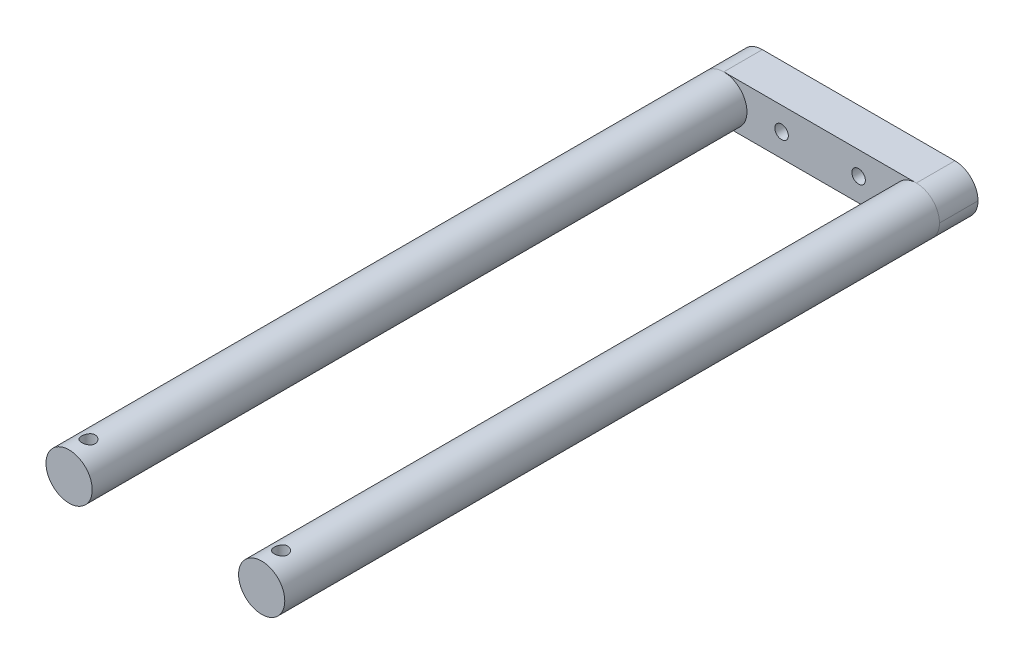
ISO-10303-21;
HEADER;
FILE_DESCRIPTION(('STEP AP214'),'2;1');
FILE_NAME('part.step','',(''),(''),'','','');
FILE_SCHEMA(('AUTOMOTIVE_DESIGN { 1 0 10303 214 1 1 1 1 }'));
ENDSEC;
DATA;
#1=APPLICATION_CONTEXT('core data for automotive mechanical design processes');
#2=APPLICATION_PROTOCOL_DEFINITION('international standard','automotive_design',2000,#1);
#3=PRODUCT_CONTEXT('',#1,'mechanical');
#4=PRODUCT('Part','Part','',(#3));
#5=PRODUCT_RELATED_PRODUCT_CATEGORY('part','',(#4));
#6=PRODUCT_DEFINITION_FORMATION('','',#4);
#7=PRODUCT_DEFINITION_CONTEXT('part definition',#1,'design');
#8=PRODUCT_DEFINITION('design','',#6,#7);
#9=PRODUCT_DEFINITION_SHAPE('','',#8);
#10=(LENGTH_UNIT() NAMED_UNIT(*) SI_UNIT(.MILLI.,.METRE.));
#11=(NAMED_UNIT(*) PLANE_ANGLE_UNIT() SI_UNIT($,.RADIAN.));
#12=(NAMED_UNIT(*) SI_UNIT($,.STERADIAN.) SOLID_ANGLE_UNIT());
#13=UNCERTAINTY_MEASURE_WITH_UNIT(LENGTH_MEASURE(1.E-05),#10,'distance_accuracy_value','');
#14=(GEOMETRIC_REPRESENTATION_CONTEXT(3) GLOBAL_UNCERTAINTY_ASSIGNED_CONTEXT((#13)) GLOBAL_UNIT_ASSIGNED_CONTEXT((#10,
#11,#12)) REPRESENTATION_CONTEXT('',''));
#15=CARTESIAN_POINT('',(0.,0.,0.));
#16=DIRECTION('',(0.,0.,1.));
#17=DIRECTION('',(1.,0.,0.));
#18=AXIS2_PLACEMENT_3D('',#15,#16,#17);
#19=CARTESIAN_POINT('',(0.,0.,10.));
#20=DIRECTION('',(0.,0.,1.));
#21=DIRECTION('',(1.,0.,0.));
#22=AXIS2_PLACEMENT_3D('',#19,#20,#21);
#23=PLANE('',#22);
#24=CARTESIAN_POINT('',(10.,0.,10.));
#25=DIRECTION('',(0.,0.,1.));
#26=DIRECTION('',(1.,0.,0.));
#27=AXIS2_PLACEMENT_3D('',#24,#25,#26);
#28=CIRCLE('',#27,1.75);
#29=CARTESIAN_POINT('',(11.75,0.,10.));
#30=VERTEX_POINT('',#29);
#31=EDGE_CURVE('E229',#30,#30,#28,.F.);
#32=ORIENTED_EDGE('',*,*,#31,.T.);
#33=EDGE_LOOP('',(#32));
#34=FACE_BOUND('',#33,.T.);
#35=CARTESIAN_POINT('',(-10.,0.,10.));
#36=DIRECTION('',(0.,0.,1.));
#37=DIRECTION('',(1.,0.,0.));
#38=AXIS2_PLACEMENT_3D('',#35,#36,#37);
#39=CIRCLE('',#38,1.75);
#40=CARTESIAN_POINT('',(-8.25,0.,10.));
#41=VERTEX_POINT('',#40);
#42=EDGE_CURVE('E223',#41,#41,#39,.F.);
#43=ORIENTED_EDGE('',*,*,#42,.T.);
#44=EDGE_LOOP('',(#43));
#45=FACE_BOUND('',#44,.T.);
#46=DIRECTION('',(1.,0.,0.));
#47=VECTOR('',#46,1.);
#48=CARTESIAN_POINT('',(-31.,-6.,10.));
#49=LINE('',#48,#47);
#50=CARTESIAN_POINT('',(-25.,-6.,10.));
#51=VERTEX_POINT('',#50);
#52=CARTESIAN_POINT('',(25.,-5.99999999999999,10.));
#53=VERTEX_POINT('',#52);
#54=EDGE_CURVE('E111',#51,#53,#49,.T.);
#55=ORIENTED_EDGE('',*,*,#54,.T.);
#56=CARTESIAN_POINT('',(25.,0.,10.));
#57=DIRECTION('',(0.,0.,1.));
#58=DIRECTION('',(1.,0.,0.));
#59=AXIS2_PLACEMENT_3D('',#56,#57,#58);
#60=CIRCLE('',#59,5.99999999999999);
#61=CARTESIAN_POINT('',(25.,5.99999999999999,10.));
#62=VERTEX_POINT('',#61);
#63=EDGE_CURVE('E97',#53,#62,#60,.F.);
#64=ORIENTED_EDGE('',*,*,#63,.T.);
#65=DIRECTION('',(-1.,0.,0.));
#66=VECTOR('',#65,1.);
#67=CARTESIAN_POINT('',(-31.,6.,10.));
#68=LINE('',#67,#66);
#69=CARTESIAN_POINT('',(-25.,5.99999999999999,10.));
#70=VERTEX_POINT('',#69);
#71=EDGE_CURVE('E108',#62,#70,#68,.T.);
#72=ORIENTED_EDGE('',*,*,#71,.T.);
#73=CARTESIAN_POINT('',(-25.,0.,10.));
#74=DIRECTION('',(0.,0.,1.));
#75=DIRECTION('',(1.,0.,0.));
#76=AXIS2_PLACEMENT_3D('',#73,#74,#75);
#77=CIRCLE('',#76,5.99999999999999);
#78=EDGE_CURVE('E216',#51,#70,#77,.T.);
#79=ORIENTED_EDGE('',*,*,#78,.F.);
#80=EDGE_LOOP('',(#55,#64,#72,#79));
#81=FACE_BOUND('',#80,.T.);
#82=ADVANCED_FACE('F34',(#34,#45,#81),#23,.T.);
#83=CARTESIAN_POINT('',(-31.,6.,10.));
#84=DIRECTION('',(0.,-1.,0.));
#85=DIRECTION('',(0.,0.,-1.));
#86=AXIS2_PLACEMENT_3D('',#83,#84,#85);
#87=PLANE('',#86);
#88=DIRECTION('',(-1.,0.,0.));
#89=VECTOR('',#88,1.);
#90=CARTESIAN_POINT('',(-31.,6.,0.));
#91=LINE('',#90,#89);
#92=CARTESIAN_POINT('',(25.,6.,0.));
#93=VERTEX_POINT('',#92);
#94=CARTESIAN_POINT('',(-25.,6.,0.));
#95=VERTEX_POINT('',#94);
#96=EDGE_CURVE('E213',#93,#95,#91,.T.);
#97=ORIENTED_EDGE('',*,*,#96,.T.);
#98=DIRECTION('',(0.,0.,-1.));
#99=VECTOR('',#98,1.);
#100=CARTESIAN_POINT('',(-25.,6.,10.));
#101=LINE('',#100,#99);
#102=EDGE_CURVE('E118',#95,#70,#101,.F.);
#103=ORIENTED_EDGE('',*,*,#102,.T.);
#104=ORIENTED_EDGE('',*,*,#71,.F.);
#105=DIRECTION('',(0.,0.,-1.));
#106=VECTOR('',#105,1.);
#107=CARTESIAN_POINT('',(25.,6.,10.));
#108=LINE('',#107,#106);
#109=EDGE_CURVE('E116',#62,#93,#108,.T.);
#110=ORIENTED_EDGE('',*,*,#109,.T.);
#111=EDGE_LOOP('',(#97,#103,#104,#110));
#112=FACE_BOUND('',#111,.T.);
#113=ADVANCED_FACE('F115',(#112),#87,.F.);
#114=CARTESIAN_POINT('',(-31.,-6.,10.));
#115=DIRECTION('',(0.,1.,0.));
#116=DIRECTION('',(0.,0.,1.));
#117=AXIS2_PLACEMENT_3D('',#114,#115,#116);
#118=PLANE('',#117);
#119=ORIENTED_EDGE('',*,*,#54,.F.);
#120=DIRECTION('',(0.,0.,-1.));
#121=VECTOR('',#120,1.);
#122=CARTESIAN_POINT('',(-25.,-6.,10.));
#123=LINE('',#122,#121);
#124=CARTESIAN_POINT('',(-25.,-6.,0.));
#125=VERTEX_POINT('',#124);
#126=EDGE_CURVE('E205',#51,#125,#123,.T.);
#127=ORIENTED_EDGE('',*,*,#126,.T.);
#128=DIRECTION('',(1.,0.,0.));
#129=VECTOR('',#128,1.);
#130=CARTESIAN_POINT('',(-31.,-6.,0.));
#131=LINE('',#130,#129);
#132=CARTESIAN_POINT('',(25.,-6.,0.));
#133=VERTEX_POINT('',#132);
#134=EDGE_CURVE('E119',#125,#133,#131,.T.);
#135=ORIENTED_EDGE('',*,*,#134,.T.);
#136=DIRECTION('',(0.,0.,-1.));
#137=VECTOR('',#136,1.);
#138=CARTESIAN_POINT('',(25.,-6.,10.));
#139=LINE('',#138,#137);
#140=EDGE_CURVE('E202',#133,#53,#139,.F.);
#141=ORIENTED_EDGE('',*,*,#140,.T.);
#142=EDGE_LOOP('',(#119,#127,#135,#141));
#143=FACE_BOUND('',#142,.T.);
#144=ADVANCED_FACE('F176',(#143),#118,.F.);
#145=CARTESIAN_POINT('',(0.,0.,0.));
#146=DIRECTION('',(0.,0.,1.));
#147=DIRECTION('',(1.,0.,0.));
#148=AXIS2_PLACEMENT_3D('',#145,#146,#147);
#149=PLANE('',#148);
#150=CARTESIAN_POINT('',(10.,0.,0.));
#151=DIRECTION('',(0.,0.,-1.));
#152=DIRECTION('',(-1.,0.,0.));
#153=AXIS2_PLACEMENT_3D('',#150,#151,#152);
#154=CIRCLE('',#153,1.75);
#155=CARTESIAN_POINT('',(8.25,0.,0.));
#156=VERTEX_POINT('',#155);
#157=EDGE_CURVE('E133',#156,#156,#154,.T.);
#158=ORIENTED_EDGE('',*,*,#157,.F.);
#159=EDGE_LOOP('',(#158));
#160=FACE_BOUND('',#159,.T.);
#161=CARTESIAN_POINT('',(-10.,0.,0.));
#162=DIRECTION('',(0.,0.,-1.));
#163=DIRECTION('',(-1.,0.,0.));
#164=AXIS2_PLACEMENT_3D('',#161,#162,#163);
#165=CIRCLE('',#164,1.75);
#166=CARTESIAN_POINT('',(-11.75,0.,0.));
#167=VERTEX_POINT('',#166);
#168=EDGE_CURVE('E226',#167,#167,#165,.T.);
#169=ORIENTED_EDGE('',*,*,#168,.F.);
#170=EDGE_LOOP('',(#169));
#171=FACE_BOUND('',#170,.T.);
#172=ORIENTED_EDGE('',*,*,#134,.F.);
#173=CARTESIAN_POINT('',(-25.,0.,0.));
#174=DIRECTION('',(0.,0.,1.));
#175=DIRECTION('',(1.,0.,0.));
#176=AXIS2_PLACEMENT_3D('',#173,#174,#175);
#177=CIRCLE('',#176,6.);
#178=CARTESIAN_POINT('',(-31.,0.,0.));
#179=VERTEX_POINT('',#178);
#180=EDGE_CURVE('E122',#125,#179,#177,.F.);
#181=ORIENTED_EDGE('',*,*,#180,.T.);
#182=CARTESIAN_POINT('',(-25.,0.,0.));
#183=DIRECTION('',(0.,0.,1.));
#184=DIRECTION('',(1.,0.,0.));
#185=AXIS2_PLACEMENT_3D('',#182,#183,#184);
#186=CIRCLE('',#185,6.);
#187=EDGE_CURVE('E54',#179,#95,#186,.F.);
#188=ORIENTED_EDGE('',*,*,#187,.T.);
#189=ORIENTED_EDGE('',*,*,#96,.F.);
#190=CARTESIAN_POINT('',(25.,0.,0.));
#191=DIRECTION('',(0.,0.,1.));
#192=DIRECTION('',(1.,0.,0.));
#193=AXIS2_PLACEMENT_3D('',#190,#191,#192);
#194=CIRCLE('',#193,6.);
#195=CARTESIAN_POINT('',(31.,0.,0.));
#196=VERTEX_POINT('',#195);
#197=EDGE_CURVE('E62',#93,#196,#194,.F.);
#198=ORIENTED_EDGE('',*,*,#197,.T.);
#199=CARTESIAN_POINT('',(25.,0.,0.));
#200=DIRECTION('',(0.,0.,1.));
#201=DIRECTION('',(1.,0.,0.));
#202=AXIS2_PLACEMENT_3D('',#199,#200,#201);
#203=CIRCLE('',#202,6.);
#204=EDGE_CURVE('E201',#196,#133,#203,.F.);
#205=ORIENTED_EDGE('',*,*,#204,.T.);
#206=EDGE_LOOP('',(#172,#181,#188,#189,#198,#205));
#207=FACE_BOUND('',#206,.T.);
#208=ADVANCED_FACE('F183',(#160,#171,#207),#149,.F.);
#209=CARTESIAN_POINT('',(-25.,0.,180.));
#210=DIRECTION('',(0.,0.,-1.));
#211=DIRECTION('',(-1.,0.,0.));
#212=AXIS2_PLACEMENT_3D('',#209,#210,#211);
#213=CYLINDRICAL_SURFACE('',#212,5.99999999999999);
#214=CARTESIAN_POINT('',(-25.,-5.99999999999999,176.75));
#215=CARTESIAN_POINT('',(-24.9038746919819,-5.99999897932777,176.749998515148));
#216=CARTESIAN_POINT('',(-24.8077342610221,-5.99766772555915,176.742053590018));
#217=CARTESIAN_POINT('',(-24.6182453338816,-5.98859526937578,176.710554203932));
#218=CARTESIAN_POINT('',(-24.5248978134295,-5.98185254415877,176.686994352799));
#219=CARTESIAN_POINT('',(-24.3437556707296,-5.96469737869573,176.625112993817));
#220=CARTESIAN_POINT('',(-24.2559533275376,-5.95429017982354,176.586812562489));
#221=CARTESIAN_POINT('',(-24.0880170763676,-5.93089244308037,176.4966215584));
#222=CARTESIAN_POINT('',(-24.0078840631656,-5.91790160432061,176.444729402533));
#223=CARTESIAN_POINT('',(-23.8553743811309,-5.89033024399656,176.327334984187));
#224=CARTESIAN_POINT('',(-23.7832366435688,-5.87571850769826,176.261529664167));
#225=CARTESIAN_POINT('',(-23.6508483335476,-5.8467419891084,176.118823271007));
#226=CARTESIAN_POINT('',(-23.5905996311233,-5.83237724599042,176.041920455622));
#227=CARTESIAN_POINT('',(-23.4824666332596,-5.8051938351212,175.877210332861));
#228=CARTESIAN_POINT('',(-23.4348695839556,-5.79241411758614,175.789207418234));
#229=CARTESIAN_POINT('',(-23.3552460863704,-5.77031231698369,175.606013923598));
#230=CARTESIAN_POINT('',(-23.3232161293996,-5.76098945488302,175.510824968855));
#231=CARTESIAN_POINT('',(-23.2764893691659,-5.74718144308773,175.318635370298));
#232=CARTESIAN_POINT('',(-23.2613539098261,-5.74257413524903,175.221750382535));
#233=CARTESIAN_POINT('',(-23.2474765365576,-5.73835505823414,175.026715208586));
#234=CARTESIAN_POINT('',(-23.2487308936446,-5.73874215273941,174.928565315265));
#235=CARTESIAN_POINT('',(-23.2672520472347,-5.74435959682318,174.737315245408));
#236=CARTESIAN_POINT('',(-23.2839743160693,-5.74942523520473,174.644156704703));
#237=CARTESIAN_POINT('',(-23.3320788250214,-5.76356324195847,174.462029189039));
#238=CARTESIAN_POINT('',(-23.3634624403772,-5.77263598619393,174.373060607962));
#239=CARTESIAN_POINT('',(-23.440410747292,-5.79390080921966,174.200484008019));
#240=CARTESIAN_POINT('',(-23.4861557160676,-5.80613217077635,174.116961417586));
#241=CARTESIAN_POINT('',(-23.5904028022505,-5.83231660479804,173.958593232403));
#242=CARTESIAN_POINT('',(-23.6489078641296,-5.84627007432714,173.883749646505));
#243=CARTESIAN_POINT('',(-23.779739593428,-5.87499914138166,173.74176939697));
#244=CARTESIAN_POINT('',(-23.8525196016261,-5.88978548224526,173.675051965685));
#245=CARTESIAN_POINT('',(-24.0084186911144,-5.91802612754817,173.554674579843));
#246=CARTESIAN_POINT('',(-24.0915383536547,-5.9314803570256,173.501015359863));
#247=CARTESIAN_POINT('',(-24.2664897280912,-5.95565253423198,173.408041655653));
#248=CARTESIAN_POINT('',(-24.3583709878036,-5.96635347926387,173.368815692189));
#249=CARTESIAN_POINT('',(-24.5478100720864,-5.98369087780732,173.306494829149));
#250=CARTESIAN_POINT('',(-24.645366395997,-5.99032840050987,173.283395685967));
#251=CARTESIAN_POINT('',(-24.8398188019716,-5.99862388766846,173.254671729569));
#252=CARTESIAN_POINT('',(-24.9366241055354,-6.00044382600872,173.24847829102));
#253=CARTESIAN_POINT('',(-25.1298949552109,-5.99937180655024,173.25215387819));
#254=CARTESIAN_POINT('',(-25.2263605424411,-5.9964804401206,173.26202088798));
#255=CARTESIAN_POINT('',(-25.4140978306641,-5.98641640064661,173.297075586824));
#256=CARTESIAN_POINT('',(-25.505436223328,-5.979335539798,173.321934939898));
#257=CARTESIAN_POINT('',(-25.6826291039212,-5.96170716095041,173.385877219331));
#258=CARTESIAN_POINT('',(-25.7684829453071,-5.95115923513567,173.424961819003));
#259=CARTESIAN_POINT('',(-25.9343925731249,-5.92740206937565,173.517225337923));
#260=CARTESIAN_POINT('',(-26.0142766127,-5.91413878305623,173.570698810949));
#261=CARTESIAN_POINT('',(-26.1641329608488,-5.88647695237989,173.689861149215));
#262=CARTESIAN_POINT('',(-26.2341029125755,-5.87207813933965,173.755552910517));
#263=CARTESIAN_POINT('',(-26.3646215858374,-5.84315282434341,173.89995535039));
#264=CARTESIAN_POINT('',(-26.424766422283,-5.82863878716342,173.979034343808));
#265=CARTESIAN_POINT('',(-26.5309555158763,-5.80165389300295,174.146476972735));
#266=CARTESIAN_POINT('',(-26.5770002187398,-5.78918297144385,174.234840314639));
#267=CARTESIAN_POINT('',(-26.6533535557184,-5.76784149110913,174.418009068341));
#268=CARTESIAN_POINT('',(-26.6837418654971,-5.75895275395433,174.51277902916));
#269=CARTESIAN_POINT('',(-26.7280482208509,-5.7458153184576,174.706395503132));
#270=CARTESIAN_POINT('',(-26.741971522099,-5.74156513950939,174.805240705027));
#271=CARTESIAN_POINT('',(-26.7526089517066,-5.73832630544295,175.000022541182));
#272=CARTESIAN_POINT('',(-26.7499789121505,-5.73913712613565,175.095920509864));
#273=CARTESIAN_POINT('',(-26.7291383184724,-5.74545008197208,175.285842892854));
#274=CARTESIAN_POINT('',(-26.7109283259395,-5.75095204802056,175.379867374567));
#275=CARTESIAN_POINT('',(-26.6598574803392,-5.76589662443702,175.562366183013));
#276=CARTESIAN_POINT('',(-26.6271612507962,-5.77529488178539,175.650890475405));
#277=CARTESIAN_POINT('',(-26.5481736361734,-5.79696714255005,175.821267246122));
#278=CARTESIAN_POINT('',(-26.5018797622437,-5.80924167234267,175.903118499537));
#279=CARTESIAN_POINT('',(-26.3951312814653,-5.83581435741764,176.060892070238));
#280=CARTESIAN_POINT('',(-26.3342416245588,-5.85016789019054,176.136510717542));
#281=CARTESIAN_POINT('',(-26.2008245265538,-5.87900256664697,176.276669675805));
#282=CARTESIAN_POINT('',(-26.1282941220337,-5.8934837419353,176.341207157114));
#283=CARTESIAN_POINT('',(-25.9712851746028,-5.92141239923085,176.459109531477));
#284=CARTESIAN_POINT('',(-25.8865360636143,-5.93482122382385,176.51212417615));
#285=CARTESIAN_POINT('',(-25.7089364520742,-5.95864200095581,176.603075249555));
#286=CARTESIAN_POINT('',(-25.6160901493361,-5.96905549446414,176.641019435231));
#287=CARTESIAN_POINT('',(-25.4366051778704,-5.98468728404805,176.696940949308));
#288=CARTESIAN_POINT('',(-25.3505861970507,-5.99038360588641,176.716786270558));
#289=CARTESIAN_POINT('',(-25.1763821745559,-5.99804015775583,176.743315510613));
#290=CARTESIAN_POINT('',(-25.0881974529297,-6.00000093649311,176.75000136239));
#291=CARTESIAN_POINT('',(-25.,-5.99999999999999,176.75));
#292=B_SPLINE_CURVE_WITH_KNOTS('',3,(#214,#215,#216,#217,#218,#219,#220,#221,#222,#223,#224,
#225,#226,#227,#228,#229,#230,#231,#232,#233,#234,#235,#236,#237,#238,#239,#240,#241,#242,#243,
#244,#245,#246,#247,#248,#249,#250,#251,#252,#253,#254,#255,#256,#257,#258,#259,#260,#261,#262,
#263,#264,#265,#266,#267,#268,#269,#270,#271,#272,#273,#274,#275,#276,#277,#278,#279,#280,#281,
#282,#283,#284,#285,#286,#287,#288,#289,#290,#291),.UNSPECIFIED.,.T.,.F.,(4,2,2,2,2,2,2,2,2,2,2,
2,2,2,2,2,2,2,2,2,2,2,2,2,2,2,2,2,2,2,2,2,2,2,2,2,2,2,4),(0.,0.288052093618853,
0.576203672859806,0.863944765925743,1.15171938874705,1.44656421076711,1.74145537223884,
2.0425595140536,2.34359575805744,2.63661948180929,2.92957653844229,3.21259753810653,
3.49564509054991,3.78239825352139,4.06921765673402,4.36732499534254,4.6654490998204,
4.96537230276013,5.26521655422947,5.55484346037067,5.84443401496554,6.12790175562712,
6.41140285130437,6.70121883369903,6.99110359801336,7.29089914342067,7.59068521108751,
7.88893020644376,8.18707997551209,8.47349366019237,8.7598970213495,9.04312596000905,
9.32640677192027,9.61950228446211,9.91267252994442,10.2137891731666,10.5147506265853,
10.779084693066,11.0433799290662),.UNSPECIFIED.);
#293=CARTESIAN_POINT('',(-25.,-5.99999999999999,176.75));
#294=VERTEX_POINT('',#293);
#295=EDGE_CURVE('E11',#294,#294,#292,.T.);
#296=ORIENTED_EDGE('',*,*,#295,.T.);
#297=EDGE_LOOP('',(#296));
#298=FACE_BOUND('',#297,.T.);
#299=CARTESIAN_POINT('',(-25.,5.99999999999999,176.75));
#300=CARTESIAN_POINT('',(-25.0961253080181,5.99999897932777,176.749998515148));
#301=CARTESIAN_POINT('',(-25.1922657389779,5.99766772555915,176.742053590018));
#302=CARTESIAN_POINT('',(-25.3817546661184,5.98859526937578,176.710554203932));
#303=CARTESIAN_POINT('',(-25.4751021865705,5.98185254415877,176.686994352799));
#304=CARTESIAN_POINT('',(-25.6562443292704,5.96469737869573,176.625112993817));
#305=CARTESIAN_POINT('',(-25.7440466724624,5.95429017982354,176.586812562489));
#306=CARTESIAN_POINT('',(-25.9119829236324,5.93089244308037,176.4966215584));
#307=CARTESIAN_POINT('',(-25.9921159368344,5.91790160432061,176.444729402533));
#308=CARTESIAN_POINT('',(-26.1446256188691,5.89033024399656,176.327334984187));
#309=CARTESIAN_POINT('',(-26.2167633564312,5.87571850769826,176.261529664167));
#310=CARTESIAN_POINT('',(-26.3491516664524,5.8467419891084,176.118823271007));
#311=CARTESIAN_POINT('',(-26.4094003688767,5.83237724599042,176.041920455622));
#312=CARTESIAN_POINT('',(-26.5175333667404,5.8051938351212,175.877210332861));
#313=CARTESIAN_POINT('',(-26.5651304160444,5.79241411758614,175.789207418234));
#314=CARTESIAN_POINT('',(-26.6447539136296,5.77031231698369,175.606013923598));
#315=CARTESIAN_POINT('',(-26.6767838706004,5.76098945488302,175.510824968855));
#316=CARTESIAN_POINT('',(-26.7235106308341,5.74718144308773,175.318635370298));
#317=CARTESIAN_POINT('',(-26.7386460901739,5.74257413524903,175.221750382535));
#318=CARTESIAN_POINT('',(-26.7525234634424,5.73835505823414,175.026715208586));
#319=CARTESIAN_POINT('',(-26.7512691063554,5.73874215273941,174.928565315265));
#320=CARTESIAN_POINT('',(-26.7327479527653,5.74435959682318,174.737315245408));
#321=CARTESIAN_POINT('',(-26.7160256839307,5.74942523520473,174.644156704703));
#322=CARTESIAN_POINT('',(-26.6679211749786,5.76356324195847,174.462029189039));
#323=CARTESIAN_POINT('',(-26.6365375596228,5.77263598619393,174.373060607962));
#324=CARTESIAN_POINT('',(-26.559589252708,5.79390080921966,174.200484008019));
#325=CARTESIAN_POINT('',(-26.5138442839324,5.80613217077635,174.116961417586));
#326=CARTESIAN_POINT('',(-26.4095971977495,5.83231660479804,173.958593232403));
#327=CARTESIAN_POINT('',(-26.3510921358704,5.84627007432714,173.883749646505));
#328=CARTESIAN_POINT('',(-26.220260406572,5.87499914138166,173.74176939697));
#329=CARTESIAN_POINT('',(-26.1474803983739,5.88978548224526,173.675051965685));
#330=CARTESIAN_POINT('',(-25.9915813088856,5.91802612754818,173.554674579843));
#331=CARTESIAN_POINT('',(-25.9084616463453,5.9314803570256,173.501015359863));
#332=CARTESIAN_POINT('',(-25.7335102719088,5.95565253423198,173.408041655653));
#333=CARTESIAN_POINT('',(-25.6416290121964,5.96635347926387,173.368815692189));
#334=CARTESIAN_POINT('',(-25.4521899279136,5.98369087780732,173.306494829149));
#335=CARTESIAN_POINT('',(-25.354633604003,5.99032840050987,173.283395685967));
#336=CARTESIAN_POINT('',(-25.1601811980284,5.99862388766846,173.254671729569));
#337=CARTESIAN_POINT('',(-25.0633758944646,6.00044382600872,173.24847829102));
#338=CARTESIAN_POINT('',(-24.8701050447891,5.99937180655024,173.25215387819));
#339=CARTESIAN_POINT('',(-24.7736394575589,5.9964804401206,173.26202088798));
#340=CARTESIAN_POINT('',(-24.5859021693359,5.98641640064661,173.297075586824));
#341=CARTESIAN_POINT('',(-24.494563776672,5.979335539798,173.321934939898));
#342=CARTESIAN_POINT('',(-24.3173708960788,5.96170716095041,173.385877219331));
#343=CARTESIAN_POINT('',(-24.2315170546929,5.95115923513567,173.424961819003));
#344=CARTESIAN_POINT('',(-24.0656074268752,5.92740206937565,173.517225337923));
#345=CARTESIAN_POINT('',(-23.9857233873,5.91413878305623,173.570698810949));
#346=CARTESIAN_POINT('',(-23.8358670391512,5.88647695237989,173.689861149215));
#347=CARTESIAN_POINT('',(-23.7658970874245,5.87207813933965,173.755552910517));
#348=CARTESIAN_POINT('',(-23.6353784141626,5.84315282434341,173.89995535039));
#349=CARTESIAN_POINT('',(-23.575233577717,5.82863878716342,173.979034343808));
#350=CARTESIAN_POINT('',(-23.4690444841237,5.80165389300295,174.146476972735));
#351=CARTESIAN_POINT('',(-23.4229997812602,5.78918297144385,174.234840314639));
#352=CARTESIAN_POINT('',(-23.3466464442817,5.76784149110913,174.418009068341));
#353=CARTESIAN_POINT('',(-23.3162581345029,5.75895275395433,174.51277902916));
#354=CARTESIAN_POINT('',(-23.2719517791491,5.7458153184576,174.706395503132));
#355=CARTESIAN_POINT('',(-23.258028477901,5.74156513950939,174.805240705027));
#356=CARTESIAN_POINT('',(-23.2473910482934,5.73832630544295,175.000022541182));
#357=CARTESIAN_POINT('',(-23.2500210878495,5.73913712613565,175.095920509864));
#358=CARTESIAN_POINT('',(-23.2708616815276,5.74545008197208,175.285842892854));
#359=CARTESIAN_POINT('',(-23.2890716740605,5.75095204802056,175.379867374567));
#360=CARTESIAN_POINT('',(-23.3401425196608,5.76589662443702,175.562366183013));
#361=CARTESIAN_POINT('',(-23.3728387492038,5.77529488178539,175.650890475405));
#362=CARTESIAN_POINT('',(-23.4518263638266,5.79696714255005,175.821267246122));
#363=CARTESIAN_POINT('',(-23.4981202377563,5.80924167234267,175.903118499537));
#364=CARTESIAN_POINT('',(-23.6048687185347,5.83581435741764,176.060892070238));
#365=CARTESIAN_POINT('',(-23.6657583754412,5.85016789019054,176.136510717542));
#366=CARTESIAN_POINT('',(-23.7991754734462,5.87900256664697,176.276669675805));
#367=CARTESIAN_POINT('',(-23.8717058779663,5.8934837419353,176.341207157114));
#368=CARTESIAN_POINT('',(-24.0287148253972,5.92141239923085,176.459109531477));
#369=CARTESIAN_POINT('',(-24.1134639363857,5.93482122382385,176.51212417615));
#370=CARTESIAN_POINT('',(-24.2910635479258,5.95864200095581,176.603075249555));
#371=CARTESIAN_POINT('',(-24.3839098506639,5.96905549446414,176.641019435231));
#372=CARTESIAN_POINT('',(-24.5633948221296,5.98468728404805,176.696940949308));
#373=CARTESIAN_POINT('',(-24.6494138029493,5.99038360588641,176.716786270558));
#374=CARTESIAN_POINT('',(-24.8236178254442,5.99804015775583,176.743315510613));
#375=CARTESIAN_POINT('',(-24.9118025470703,6.00000093649311,176.75000136239));
#376=CARTESIAN_POINT('',(-25.,5.99999999999999,176.75));
#377=B_SPLINE_CURVE_WITH_KNOTS('',3,(#299,#300,#301,#302,#303,#304,#305,#306,#307,#308,#309,
#310,#311,#312,#313,#314,#315,#316,#317,#318,#319,#320,#321,#322,#323,#324,#325,#326,#327,#328,
#329,#330,#331,#332,#333,#334,#335,#336,#337,#338,#339,#340,#341,#342,#343,#344,#345,#346,#347,
#348,#349,#350,#351,#352,#353,#354,#355,#356,#357,#358,#359,#360,#361,#362,#363,#364,#365,#366,
#367,#368,#369,#370,#371,#372,#373,#374,#375,#376),.UNSPECIFIED.,.T.,.F.,(4,2,2,2,2,2,2,2,2,2,2,
2,2,2,2,2,2,2,2,2,2,2,2,2,2,2,2,2,2,2,2,2,2,2,2,2,2,2,4),(0.,0.288052093618853,
0.576203672859806,0.863944765925743,1.15171938874705,1.44656421076711,1.74145537223884,
2.0425595140536,2.34359575805744,2.63661948180929,2.92957653844229,3.21259753810653,
3.49564509054991,3.78239825352139,4.06921765673402,4.36732499534255,4.6654490998204,
4.96537230276013,5.26521655422947,5.55484346037067,5.84443401496554,6.12790175562712,
6.41140285130437,6.70121883369903,6.99110359801335,7.29089914342067,7.59068521108751,
7.88893020644376,8.18707997551208,8.47349366019236,8.7598970213495,9.04312596000905,
9.32640677192027,9.61950228446211,9.91267252994441,10.2137891731666,10.5147506265853,
10.779084693066,11.0433799290662),.UNSPECIFIED.);
#378=CARTESIAN_POINT('',(-25.,5.99999999999999,176.75));
#379=VERTEX_POINT('',#378);
#380=EDGE_CURVE('E47',#379,#379,#377,.T.);
#381=ORIENTED_EDGE('',*,*,#380,.T.);
#382=EDGE_LOOP('',(#381));
#383=FACE_BOUND('',#382,.T.);
#384=CARTESIAN_POINT('',(-25.,0.,180.));
#385=DIRECTION('',(0.,0.,1.));
#386=DIRECTION('',(1.,0.,0.));
#387=AXIS2_PLACEMENT_3D('',#384,#385,#386);
#388=CIRCLE('',#387,5.99999999999999);
#389=CARTESIAN_POINT('',(-19.,0.,180.));
#390=VERTEX_POINT('',#389);
#391=EDGE_CURVE('E215',#390,#390,#388,.T.);
#392=ORIENTED_EDGE('',*,*,#391,.F.);
#393=EDGE_LOOP('',(#392));
#394=FACE_BOUND('',#393,.T.);
#395=CARTESIAN_POINT('',(-31.,0.,10.));
#396=VERTEX_POINT('',#395);
#397=EDGE_CURVE('E218',#70,#396,#77,.T.);
#398=ORIENTED_EDGE('',*,*,#397,.T.);
#399=EDGE_CURVE('E112',#396,#51,#77,.T.);
#400=ORIENTED_EDGE('',*,*,#399,.T.);
#401=ORIENTED_EDGE('',*,*,#78,.T.);
#402=EDGE_LOOP('',(#398,#400,#401));
#403=FACE_BOUND('',#402,.T.);
#404=ADVANCED_FACE('F181',(#298,#383,#394,#403),#213,.T.);
#405=CARTESIAN_POINT('',(-25.,0.,180.));
#406=DIRECTION('',(0.,0.,1.));
#407=DIRECTION('',(1.,0.,0.));
#408=AXIS2_PLACEMENT_3D('',#405,#406,#407);
#409=PLANE('',#408);
#410=ORIENTED_EDGE('',*,*,#391,.T.);
#411=EDGE_LOOP('',(#410));
#412=FACE_BOUND('',#411,.T.);
#413=ADVANCED_FACE('F167',(#412),#409,.T.);
#414=CARTESIAN_POINT('',(25.,0.,180.));
#415=DIRECTION('',(0.,0.,-1.));
#416=DIRECTION('',(-1.,0.,0.));
#417=AXIS2_PLACEMENT_3D('',#414,#415,#416);
#418=CYLINDRICAL_SURFACE('',#417,5.99999999999999);
#419=CARTESIAN_POINT('',(25.,-5.99999999999999,176.75));
#420=CARTESIAN_POINT('',(25.0961253080181,-5.99999897932777,176.749998515148));
#421=CARTESIAN_POINT('',(25.1922657389779,-5.99766772555915,176.742053590018));
#422=CARTESIAN_POINT('',(25.3817546661184,-5.98859526937578,176.710554203932));
#423=CARTESIAN_POINT('',(25.4751021865705,-5.98185254415877,176.686994352799));
#424=CARTESIAN_POINT('',(25.6562443292704,-5.96469737869573,176.625112993817));
#425=CARTESIAN_POINT('',(25.7440466724624,-5.95429017982354,176.586812562489));
#426=CARTESIAN_POINT('',(25.9119829236324,-5.93089244308037,176.4966215584));
#427=CARTESIAN_POINT('',(25.9921159368344,-5.91790160432061,176.444729402533));
#428=CARTESIAN_POINT('',(26.1446256188691,-5.89033024399656,176.327334984187));
#429=CARTESIAN_POINT('',(26.2167633564312,-5.87571850769826,176.261529664167));
#430=CARTESIAN_POINT('',(26.3491516664524,-5.8467419891084,176.118823271007));
#431=CARTESIAN_POINT('',(26.4094003688767,-5.83237724599042,176.041920455622));
#432=CARTESIAN_POINT('',(26.5175333667404,-5.8051938351212,175.877210332861));
#433=CARTESIAN_POINT('',(26.5651304160444,-5.79241411758614,175.789207418234));
#434=CARTESIAN_POINT('',(26.6447539136296,-5.77031231698369,175.606013923598));
#435=CARTESIAN_POINT('',(26.6767838706004,-5.76098945488302,175.510824968855));
#436=CARTESIAN_POINT('',(26.7235106308341,-5.74718144308773,175.318635370298));
#437=CARTESIAN_POINT('',(26.7386460901739,-5.74257413524903,175.221750382535));
#438=CARTESIAN_POINT('',(26.7525234634424,-5.73835505823414,175.026715208586));
#439=CARTESIAN_POINT('',(26.7512691063554,-5.73874215273941,174.928565315265));
#440=CARTESIAN_POINT('',(26.7327479527653,-5.74435959682318,174.737315245408));
#441=CARTESIAN_POINT('',(26.7160256839307,-5.74942523520473,174.644156704703));
#442=CARTESIAN_POINT('',(26.6679211749786,-5.76356324195847,174.462029189039));
#443=CARTESIAN_POINT('',(26.6365375596228,-5.77263598619393,174.373060607962));
#444=CARTESIAN_POINT('',(26.559589252708,-5.79390080921966,174.200484008019));
#445=CARTESIAN_POINT('',(26.5138442839324,-5.80613217077635,174.116961417586));
#446=CARTESIAN_POINT('',(26.4095971977495,-5.83231660479804,173.958593232403));
#447=CARTESIAN_POINT('',(26.3510921358704,-5.84627007432714,173.883749646505));
#448=CARTESIAN_POINT('',(26.220260406572,-5.87499914138166,173.74176939697));
#449=CARTESIAN_POINT('',(26.1474803983739,-5.88978548224526,173.675051965685));
#450=CARTESIAN_POINT('',(25.9915813088856,-5.91802612754818,173.554674579843));
#451=CARTESIAN_POINT('',(25.9084616463453,-5.9314803570256,173.501015359863));
#452=CARTESIAN_POINT('',(25.7335102719088,-5.95565253423198,173.408041655653));
#453=CARTESIAN_POINT('',(25.6416290121964,-5.96635347926387,173.368815692189));
#454=CARTESIAN_POINT('',(25.4521899279136,-5.98369087780732,173.306494829149));
#455=CARTESIAN_POINT('',(25.354633604003,-5.99032840050987,173.283395685967));
#456=CARTESIAN_POINT('',(25.1601811980284,-5.99862388766846,173.254671729569));
#457=CARTESIAN_POINT('',(25.0633758944646,-6.00044382600872,173.24847829102));
#458=CARTESIAN_POINT('',(24.8701050447891,-5.99937180655024,173.25215387819));
#459=CARTESIAN_POINT('',(24.7736394575589,-5.9964804401206,173.26202088798));
#460=CARTESIAN_POINT('',(24.5859021693359,-5.98641640064661,173.297075586824));
#461=CARTESIAN_POINT('',(24.494563776672,-5.979335539798,173.321934939898));
#462=CARTESIAN_POINT('',(24.3173708960788,-5.96170716095041,173.385877219331));
#463=CARTESIAN_POINT('',(24.2315170546929,-5.95115923513567,173.424961819003));
#464=CARTESIAN_POINT('',(24.0656074268752,-5.92740206937565,173.517225337923));
#465=CARTESIAN_POINT('',(23.9857233873,-5.91413878305623,173.570698810949));
#466=CARTESIAN_POINT('',(23.8358670391512,-5.88647695237989,173.689861149215));
#467=CARTESIAN_POINT('',(23.7658970874245,-5.87207813933965,173.755552910517));
#468=CARTESIAN_POINT('',(23.6353784141626,-5.84315282434341,173.89995535039));
#469=CARTESIAN_POINT('',(23.575233577717,-5.82863878716342,173.979034343808));
#470=CARTESIAN_POINT('',(23.4690444841237,-5.80165389300295,174.146476972735));
#471=CARTESIAN_POINT('',(23.4229997812602,-5.78918297144385,174.234840314639));
#472=CARTESIAN_POINT('',(23.3466464442817,-5.76784149110913,174.418009068341));
#473=CARTESIAN_POINT('',(23.3162581345029,-5.75895275395433,174.51277902916));
#474=CARTESIAN_POINT('',(23.2719517791491,-5.7458153184576,174.706395503132));
#475=CARTESIAN_POINT('',(23.258028477901,-5.74156513950939,174.805240705027));
#476=CARTESIAN_POINT('',(23.2473910482934,-5.73832630544295,175.000022541182));
#477=CARTESIAN_POINT('',(23.2500210878495,-5.73913712613565,175.095920509864));
#478=CARTESIAN_POINT('',(23.2708616815276,-5.74545008197208,175.285842892854));
#479=CARTESIAN_POINT('',(23.2890716740605,-5.75095204802056,175.379867374567));
#480=CARTESIAN_POINT('',(23.3401425196608,-5.76589662443702,175.562366183013));
#481=CARTESIAN_POINT('',(23.3728387492038,-5.77529488178539,175.650890475405));
#482=CARTESIAN_POINT('',(23.4518263638266,-5.79696714255005,175.821267246122));
#483=CARTESIAN_POINT('',(23.4981202377563,-5.80924167234267,175.903118499537));
#484=CARTESIAN_POINT('',(23.6048687185347,-5.83581435741764,176.060892070238));
#485=CARTESIAN_POINT('',(23.6657583754412,-5.85016789019054,176.136510717542));
#486=CARTESIAN_POINT('',(23.7991754734462,-5.87900256664697,176.276669675805));
#487=CARTESIAN_POINT('',(23.8717058779663,-5.8934837419353,176.341207157114));
#488=CARTESIAN_POINT('',(24.0287148253972,-5.92141239923085,176.459109531477));
#489=CARTESIAN_POINT('',(24.1134639363857,-5.93482122382385,176.51212417615));
#490=CARTESIAN_POINT('',(24.2910635479258,-5.95864200095581,176.603075249555));
#491=CARTESIAN_POINT('',(24.3839098506639,-5.96905549446414,176.641019435231));
#492=CARTESIAN_POINT('',(24.5633948221296,-5.98468728404805,176.696940949308));
#493=CARTESIAN_POINT('',(24.6494138029493,-5.99038360588641,176.716786270558));
#494=CARTESIAN_POINT('',(24.8236178254442,-5.99804015775583,176.743315510613));
#495=CARTESIAN_POINT('',(24.9118025470703,-6.00000093649311,176.75000136239));
#496=CARTESIAN_POINT('',(25.,-5.99999999999999,176.75));
#497=B_SPLINE_CURVE_WITH_KNOTS('',3,(#419,#420,#421,#422,#423,#424,#425,#426,#427,#428,#429,
#430,#431,#432,#433,#434,#435,#436,#437,#438,#439,#440,#441,#442,#443,#444,#445,#446,#447,#448,
#449,#450,#451,#452,#453,#454,#455,#456,#457,#458,#459,#460,#461,#462,#463,#464,#465,#466,#467,
#468,#469,#470,#471,#472,#473,#474,#475,#476,#477,#478,#479,#480,#481,#482,#483,#484,#485,#486,
#487,#488,#489,#490,#491,#492,#493,#494,#495,#496),.UNSPECIFIED.,.T.,.F.,(4,2,2,2,2,2,2,2,2,2,2,
2,2,2,2,2,2,2,2,2,2,2,2,2,2,2,2,2,2,2,2,2,2,2,2,2,2,2,4),(0.,0.288052093618853,
0.576203672859806,0.863944765925743,1.15171938874705,1.44656421076711,1.74145537223884,
2.0425595140536,2.34359575805744,2.63661948180929,2.92957653844229,3.21259753810653,
3.49564509054991,3.78239825352139,4.06921765673402,4.36732499534255,4.6654490998204,
4.96537230276013,5.26521655422947,5.55484346037067,5.84443401496554,6.12790175562712,
6.41140285130437,6.70121883369903,6.99110359801335,7.29089914342067,7.59068521108751,
7.88893020644376,8.18707997551208,8.47349366019236,8.7598970213495,9.04312596000905,
9.32640677192027,9.61950228446211,9.91267252994441,10.2137891731666,10.5147506265853,
10.779084693066,11.0433799290662),.UNSPECIFIED.);
#498=CARTESIAN_POINT('',(25.,-5.99999999999999,176.75));
#499=VERTEX_POINT('',#498);
#500=EDGE_CURVE('E141',#499,#499,#497,.T.);
#501=ORIENTED_EDGE('',*,*,#500,.T.);
#502=EDGE_LOOP('',(#501));
#503=FACE_BOUND('',#502,.T.);
#504=CARTESIAN_POINT('',(25.,5.99999999999999,176.75));
#505=CARTESIAN_POINT('',(24.9038746919819,5.99999897932777,176.749998515148));
#506=CARTESIAN_POINT('',(24.8077342610221,5.99766772555915,176.742053590018));
#507=CARTESIAN_POINT('',(24.6182453338816,5.98859526937578,176.710554203932));
#508=CARTESIAN_POINT('',(24.5248978134295,5.98185254415877,176.686994352799));
#509=CARTESIAN_POINT('',(24.3437556707296,5.96469737869573,176.625112993817));
#510=CARTESIAN_POINT('',(24.2559533275376,5.95429017982354,176.586812562489));
#511=CARTESIAN_POINT('',(24.0880170763676,5.93089244308037,176.4966215584));
#512=CARTESIAN_POINT('',(24.0078840631656,5.91790160432061,176.444729402533));
#513=CARTESIAN_POINT('',(23.8553743811309,5.89033024399656,176.327334984187));
#514=CARTESIAN_POINT('',(23.7832366435688,5.87571850769826,176.261529664167));
#515=CARTESIAN_POINT('',(23.6508483335476,5.8467419891084,176.118823271007));
#516=CARTESIAN_POINT('',(23.5905996311233,5.83237724599042,176.041920455622));
#517=CARTESIAN_POINT('',(23.4824666332596,5.8051938351212,175.877210332861));
#518=CARTESIAN_POINT('',(23.4348695839556,5.79241411758614,175.789207418234));
#519=CARTESIAN_POINT('',(23.3552460863704,5.77031231698369,175.606013923598));
#520=CARTESIAN_POINT('',(23.3232161293996,5.76098945488302,175.510824968855));
#521=CARTESIAN_POINT('',(23.2764893691659,5.74718144308773,175.318635370298));
#522=CARTESIAN_POINT('',(23.2613539098261,5.74257413524903,175.221750382535));
#523=CARTESIAN_POINT('',(23.2474765365576,5.73835505823414,175.026715208586));
#524=CARTESIAN_POINT('',(23.2487308936446,5.73874215273941,174.928565315265));
#525=CARTESIAN_POINT('',(23.2672520472347,5.74435959682318,174.737315245408));
#526=CARTESIAN_POINT('',(23.2839743160693,5.74942523520473,174.644156704703));
#527=CARTESIAN_POINT('',(23.3320788250214,5.76356324195847,174.462029189039));
#528=CARTESIAN_POINT('',(23.3634624403772,5.77263598619393,174.373060607962));
#529=CARTESIAN_POINT('',(23.440410747292,5.79390080921966,174.200484008019));
#530=CARTESIAN_POINT('',(23.4861557160676,5.80613217077635,174.116961417586));
#531=CARTESIAN_POINT('',(23.5904028022505,5.83231660479804,173.958593232403));
#532=CARTESIAN_POINT('',(23.6489078641296,5.84627007432714,173.883749646505));
#533=CARTESIAN_POINT('',(23.779739593428,5.87499914138166,173.74176939697));
#534=CARTESIAN_POINT('',(23.8525196016261,5.88978548224526,173.675051965685));
#535=CARTESIAN_POINT('',(24.0084186911144,5.91802612754817,173.554674579843));
#536=CARTESIAN_POINT('',(24.0915383536547,5.9314803570256,173.501015359863));
#537=CARTESIAN_POINT('',(24.2664897280912,5.95565253423198,173.408041655653));
#538=CARTESIAN_POINT('',(24.3583709878036,5.96635347926387,173.368815692189));
#539=CARTESIAN_POINT('',(24.5478100720864,5.98369087780732,173.306494829149));
#540=CARTESIAN_POINT('',(24.645366395997,5.99032840050987,173.283395685967));
#541=CARTESIAN_POINT('',(24.8398188019716,5.99862388766846,173.254671729569));
#542=CARTESIAN_POINT('',(24.9366241055354,6.00044382600872,173.24847829102));
#543=CARTESIAN_POINT('',(25.1298949552109,5.99937180655024,173.25215387819));
#544=CARTESIAN_POINT('',(25.2263605424411,5.9964804401206,173.26202088798));
#545=CARTESIAN_POINT('',(25.4140978306641,5.98641640064661,173.297075586824));
#546=CARTESIAN_POINT('',(25.505436223328,5.979335539798,173.321934939898));
#547=CARTESIAN_POINT('',(25.6826291039212,5.96170716095041,173.385877219331));
#548=CARTESIAN_POINT('',(25.7684829453071,5.95115923513567,173.424961819003));
#549=CARTESIAN_POINT('',(25.9343925731249,5.92740206937565,173.517225337923));
#550=CARTESIAN_POINT('',(26.0142766127,5.91413878305623,173.570698810949));
#551=CARTESIAN_POINT('',(26.1641329608488,5.88647695237989,173.689861149215));
#552=CARTESIAN_POINT('',(26.2341029125755,5.87207813933965,173.755552910517));
#553=CARTESIAN_POINT('',(26.3646215858374,5.84315282434341,173.89995535039));
#554=CARTESIAN_POINT('',(26.424766422283,5.82863878716342,173.979034343808));
#555=CARTESIAN_POINT('',(26.5309555158763,5.80165389300295,174.146476972735));
#556=CARTESIAN_POINT('',(26.5770002187398,5.78918297144385,174.234840314639));
#557=CARTESIAN_POINT('',(26.6533535557184,5.76784149110913,174.418009068341));
#558=CARTESIAN_POINT('',(26.6837418654971,5.75895275395433,174.51277902916));
#559=CARTESIAN_POINT('',(26.7280482208509,5.7458153184576,174.706395503132));
#560=CARTESIAN_POINT('',(26.741971522099,5.74156513950939,174.805240705027));
#561=CARTESIAN_POINT('',(26.7526089517066,5.73832630544295,175.000022541182));
#562=CARTESIAN_POINT('',(26.7499789121505,5.73913712613565,175.095920509864));
#563=CARTESIAN_POINT('',(26.7291383184724,5.74545008197208,175.285842892854));
#564=CARTESIAN_POINT('',(26.7109283259395,5.75095204802056,175.379867374567));
#565=CARTESIAN_POINT('',(26.6598574803392,5.76589662443702,175.562366183013));
#566=CARTESIAN_POINT('',(26.6271612507962,5.77529488178539,175.650890475405));
#567=CARTESIAN_POINT('',(26.5481736361734,5.79696714255005,175.821267246122));
#568=CARTESIAN_POINT('',(26.5018797622437,5.80924167234267,175.903118499537));
#569=CARTESIAN_POINT('',(26.3951312814653,5.83581435741764,176.060892070238));
#570=CARTESIAN_POINT('',(26.3342416245588,5.85016789019054,176.136510717542));
#571=CARTESIAN_POINT('',(26.2008245265538,5.87900256664697,176.276669675805));
#572=CARTESIAN_POINT('',(26.1282941220337,5.8934837419353,176.341207157114));
#573=CARTESIAN_POINT('',(25.9712851746028,5.92141239923085,176.459109531477));
#574=CARTESIAN_POINT('',(25.8865360636143,5.93482122382385,176.51212417615));
#575=CARTESIAN_POINT('',(25.7089364520742,5.95864200095581,176.603075249555));
#576=CARTESIAN_POINT('',(25.6160901493361,5.96905549446414,176.641019435231));
#577=CARTESIAN_POINT('',(25.4366051778704,5.98468728404805,176.696940949308));
#578=CARTESIAN_POINT('',(25.3505861970507,5.99038360588641,176.716786270558));
#579=CARTESIAN_POINT('',(25.1763821745559,5.99804015775583,176.743315510613));
#580=CARTESIAN_POINT('',(25.0881974529297,6.00000093649311,176.75000136239));
#581=CARTESIAN_POINT('',(25.,5.99999999999999,176.75));
#582=B_SPLINE_CURVE_WITH_KNOTS('',3,(#504,#505,#506,#507,#508,#509,#510,#511,#512,#513,#514,
#515,#516,#517,#518,#519,#520,#521,#522,#523,#524,#525,#526,#527,#528,#529,#530,#531,#532,#533,
#534,#535,#536,#537,#538,#539,#540,#541,#542,#543,#544,#545,#546,#547,#548,#549,#550,#551,#552,
#553,#554,#555,#556,#557,#558,#559,#560,#561,#562,#563,#564,#565,#566,#567,#568,#569,#570,#571,
#572,#573,#574,#575,#576,#577,#578,#579,#580,#581),.UNSPECIFIED.,.T.,.F.,(4,2,2,2,2,2,2,2,2,2,2,
2,2,2,2,2,2,2,2,2,2,2,2,2,2,2,2,2,2,2,2,2,2,2,2,2,2,2,4),(0.,0.288052093618853,
0.576203672859806,0.863944765925743,1.15171938874705,1.44656421076711,1.74145537223884,
2.0425595140536,2.34359575805744,2.63661948180929,2.92957653844229,3.21259753810653,
3.49564509054991,3.78239825352139,4.06921765673402,4.36732499534254,4.6654490998204,
4.96537230276013,5.26521655422947,5.55484346037067,5.84443401496554,6.12790175562712,
6.41140285130437,6.70121883369903,6.99110359801336,7.29089914342067,7.59068521108751,
7.88893020644376,8.18707997551209,8.47349366019237,8.7598970213495,9.04312596000905,
9.32640677192027,9.61950228446211,9.91267252994442,10.2137891731666,10.5147506265853,
10.779084693066,11.0433799290662),.UNSPECIFIED.);
#583=CARTESIAN_POINT('',(25.,5.99999999999999,176.75));
#584=VERTEX_POINT('',#583);
#585=EDGE_CURVE('E124',#584,#584,#582,.T.);
#586=ORIENTED_EDGE('',*,*,#585,.T.);
#587=EDGE_LOOP('',(#586));
#588=FACE_BOUND('',#587,.T.);
#589=CARTESIAN_POINT('',(25.,0.,180.));
#590=DIRECTION('',(0.,0.,1.));
#591=DIRECTION('',(1.,0.,0.));
#592=AXIS2_PLACEMENT_3D('',#589,#590,#591);
#593=CIRCLE('',#592,5.99999999999999);
#594=CARTESIAN_POINT('',(31.,0.,180.));
#595=VERTEX_POINT('',#594);
#596=EDGE_CURVE('E102',#595,#595,#593,.T.);
#597=ORIENTED_EDGE('',*,*,#596,.F.);
#598=EDGE_LOOP('',(#597));
#599=FACE_BOUND('',#598,.T.);
#600=CARTESIAN_POINT('',(25.,0.,10.));
#601=DIRECTION('',(0.,0.,1.));
#602=DIRECTION('',(1.,0.,0.));
#603=AXIS2_PLACEMENT_3D('',#600,#601,#602);
#604=CIRCLE('',#603,5.99999999999999);
#605=CARTESIAN_POINT('',(31.,0.,10.));
#606=VERTEX_POINT('',#605);
#607=EDGE_CURVE('E94',#606,#62,#604,.T.);
#608=ORIENTED_EDGE('',*,*,#607,.T.);
#609=ORIENTED_EDGE('',*,*,#63,.F.);
#610=EDGE_CURVE('E100',#606,#53,#60,.F.);
#611=ORIENTED_EDGE('',*,*,#610,.F.);
#612=EDGE_LOOP('',(#608,#609,#611));
#613=FACE_BOUND('',#612,.T.);
#614=ADVANCED_FACE('F96',(#503,#588,#599,#613),#418,.T.);
#615=CARTESIAN_POINT('',(25.,0.,180.));
#616=DIRECTION('',(0.,0.,1.));
#617=DIRECTION('',(1.,0.,0.));
#618=AXIS2_PLACEMENT_3D('',#615,#616,#617);
#619=PLANE('',#618);
#620=ORIENTED_EDGE('',*,*,#596,.T.);
#621=EDGE_LOOP('',(#620));
#622=FACE_BOUND('',#621,.T.);
#623=ADVANCED_FACE('F155',(#622),#619,.T.);
#624=CARTESIAN_POINT('',(-25.,0.,10.));
#625=DIRECTION('',(0.,0.,-1.));
#626=DIRECTION('',(-1.,0.,0.));
#627=AXIS2_PLACEMENT_3D('',#624,#625,#626);
#628=CYLINDRICAL_SURFACE('',#627,6.);
#629=DIRECTION('',(0.,0.,-1.));
#630=VECTOR('',#629,1.);
#631=CARTESIAN_POINT('',(-31.,0.,10.));
#632=LINE('',#631,#630);
#633=EDGE_CURVE('E103',#396,#179,#632,.T.);
#634=ORIENTED_EDGE('',*,*,#633,.F.);
#635=ORIENTED_EDGE('',*,*,#397,.F.);
#636=ORIENTED_EDGE('',*,*,#102,.F.);
#637=ORIENTED_EDGE('',*,*,#187,.F.);
#638=EDGE_LOOP('',(#634,#635,#636,#637));
#639=FACE_BOUND('',#638,.T.);
#640=ADVANCED_FACE('F158',(#639),#628,.T.);
#641=CARTESIAN_POINT('',(-25.,0.,10.));
#642=DIRECTION('',(0.,0.,-1.));
#643=DIRECTION('',(-1.,0.,0.));
#644=AXIS2_PLACEMENT_3D('',#641,#642,#643);
#645=CYLINDRICAL_SURFACE('',#644,6.);
#646=ORIENTED_EDGE('',*,*,#399,.F.);
#647=ORIENTED_EDGE('',*,*,#633,.T.);
#648=ORIENTED_EDGE('',*,*,#180,.F.);
#649=ORIENTED_EDGE('',*,*,#126,.F.);
#650=EDGE_LOOP('',(#646,#647,#648,#649));
#651=FACE_BOUND('',#650,.T.);
#652=ADVANCED_FACE('F164',(#651),#645,.T.);
#653=CARTESIAN_POINT('',(25.,0.,10.));
#654=DIRECTION('',(0.,0.,-1.));
#655=DIRECTION('',(-1.,0.,0.));
#656=AXIS2_PLACEMENT_3D('',#653,#654,#655);
#657=CYLINDRICAL_SURFACE('',#656,6.);
#658=DIRECTION('',(0.,0.,-1.));
#659=VECTOR('',#658,1.);
#660=CARTESIAN_POINT('',(31.,0.,10.));
#661=LINE('',#660,#659);
#662=EDGE_CURVE('E131',#606,#196,#661,.T.);
#663=ORIENTED_EDGE('',*,*,#662,.F.);
#664=ORIENTED_EDGE('',*,*,#610,.T.);
#665=ORIENTED_EDGE('',*,*,#140,.F.);
#666=ORIENTED_EDGE('',*,*,#204,.F.);
#667=EDGE_LOOP('',(#663,#664,#665,#666));
#668=FACE_BOUND('',#667,.T.);
#669=ADVANCED_FACE('F36',(#668),#657,.T.);
#670=CARTESIAN_POINT('',(25.,0.,10.));
#671=DIRECTION('',(0.,0.,-1.));
#672=DIRECTION('',(-1.,0.,0.));
#673=AXIS2_PLACEMENT_3D('',#670,#671,#672);
#674=CYLINDRICAL_SURFACE('',#673,6.);
#675=ORIENTED_EDGE('',*,*,#607,.F.);
#676=ORIENTED_EDGE('',*,*,#662,.T.);
#677=ORIENTED_EDGE('',*,*,#197,.F.);
#678=ORIENTED_EDGE('',*,*,#109,.F.);
#679=EDGE_LOOP('',(#675,#676,#677,#678));
#680=FACE_BOUND('',#679,.T.);
#681=ADVANCED_FACE('F121',(#680),#674,.T.);
#682=CARTESIAN_POINT('',(25.,-6.,175.));
#683=DIRECTION('',(0.,1.,0.));
#684=DIRECTION('',(0.,0.,1.));
#685=AXIS2_PLACEMENT_3D('',#682,#683,#684);
#686=CYLINDRICAL_SURFACE('',#685,1.75);
#687=ORIENTED_EDGE('',*,*,#585,.F.);
#688=EDGE_LOOP('',(#687));
#689=FACE_BOUND('',#688,.T.);
#690=ORIENTED_EDGE('',*,*,#500,.F.);
#691=EDGE_LOOP('',(#690));
#692=FACE_BOUND('',#691,.T.);
#693=ADVANCED_FACE('F148',(#689,#692),#686,.F.);
#694=CARTESIAN_POINT('',(-25.,-6.,175.));
#695=DIRECTION('',(0.,1.,0.));
#696=DIRECTION('',(0.,0.,1.));
#697=AXIS2_PLACEMENT_3D('',#694,#695,#696);
#698=CYLINDRICAL_SURFACE('',#697,1.75);
#699=ORIENTED_EDGE('',*,*,#380,.F.);
#700=EDGE_LOOP('',(#699));
#701=FACE_BOUND('',#700,.T.);
#702=ORIENTED_EDGE('',*,*,#295,.F.);
#703=EDGE_LOOP('',(#702));
#704=FACE_BOUND('',#703,.T.);
#705=ADVANCED_FACE('F151',(#701,#704),#698,.F.);
#706=CARTESIAN_POINT('',(-10.,0.,180.001));
#707=DIRECTION('',(0.,0.,-1.));
#708=DIRECTION('',(-1.,0.,0.));
#709=AXIS2_PLACEMENT_3D('',#706,#707,#708);
#710=CYLINDRICAL_SURFACE('',#709,1.75);
#711=ORIENTED_EDGE('',*,*,#42,.F.);
#712=EDGE_LOOP('',(#711));
#713=FACE_BOUND('',#712,.T.);
#714=ORIENTED_EDGE('',*,*,#168,.T.);
#715=EDGE_LOOP('',(#714));
#716=FACE_BOUND('',#715,.T.);
#717=ADVANCED_FACE('F268',(#713,#716),#710,.F.);
#718=CARTESIAN_POINT('',(10.,0.,180.001));
#719=DIRECTION('',(0.,0.,-1.));
#720=DIRECTION('',(-1.,0.,0.));
#721=AXIS2_PLACEMENT_3D('',#718,#719,#720);
#722=CYLINDRICAL_SURFACE('',#721,1.75);
#723=ORIENTED_EDGE('',*,*,#31,.F.);
#724=EDGE_LOOP('',(#723));
#725=FACE_BOUND('',#724,.T.);
#726=ORIENTED_EDGE('',*,*,#157,.T.);
#727=EDGE_LOOP('',(#726));
#728=FACE_BOUND('',#727,.T.);
#729=ADVANCED_FACE('F234',(#725,#728),#722,.F.);
#730=CLOSED_SHELL('',(#82,#113,#144,#208,#404,#413,#614,#623,#640,#652,#669,#681,#693,#705,#717,#729));
#731=MANIFOLD_SOLID_BREP('B2',#730);
#732=ADVANCED_BREP_SHAPE_REPRESENTATION('',(#18,#731),#14);
#733=SHAPE_DEFINITION_REPRESENTATION(#9,#732);
ENDSEC;
END-ISO-10303-21;
